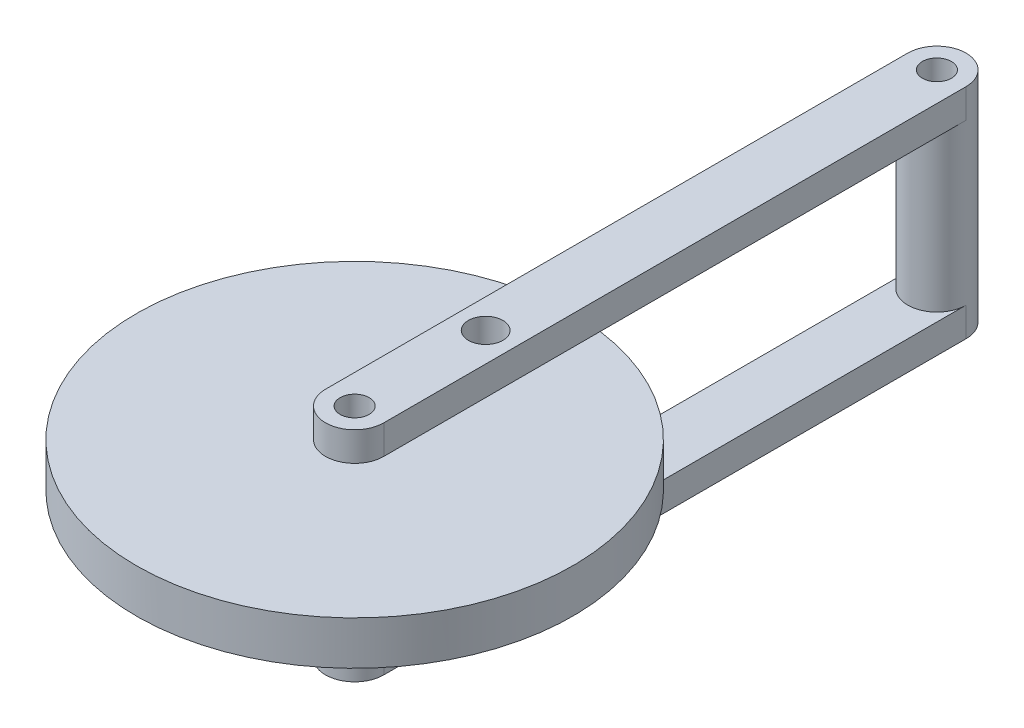
ISO-10303-21;
HEADER;
FILE_DESCRIPTION(('STEP AP214'),'2;1');
FILE_NAME('part.step','',(''),(''),'','','');
FILE_SCHEMA(('AUTOMOTIVE_DESIGN { 1 0 10303 214 1 1 1 1 }'));
ENDSEC;
DATA;
#1=APPLICATION_CONTEXT('core data for automotive mechanical design processes');
#2=APPLICATION_PROTOCOL_DEFINITION('international standard','automotive_design',2000,#1);
#3=PRODUCT_CONTEXT('',#1,'mechanical');
#4=PRODUCT('Part','Part','',(#3));
#5=PRODUCT_RELATED_PRODUCT_CATEGORY('part','',(#4));
#6=PRODUCT_DEFINITION_FORMATION('','',#4);
#7=PRODUCT_DEFINITION_CONTEXT('part definition',#1,'design');
#8=PRODUCT_DEFINITION('design','',#6,#7);
#9=PRODUCT_DEFINITION_SHAPE('','',#8);
#10=(LENGTH_UNIT() NAMED_UNIT(*) SI_UNIT(.MILLI.,.METRE.));
#11=(NAMED_UNIT(*) PLANE_ANGLE_UNIT() SI_UNIT($,.RADIAN.));
#12=(NAMED_UNIT(*) SI_UNIT($,.STERADIAN.) SOLID_ANGLE_UNIT());
#13=UNCERTAINTY_MEASURE_WITH_UNIT(LENGTH_MEASURE(1.E-05),#10,'distance_accuracy_value','');
#14=(GEOMETRIC_REPRESENTATION_CONTEXT(3) GLOBAL_UNCERTAINTY_ASSIGNED_CONTEXT((#13)) GLOBAL_UNIT_ASSIGNED_CONTEXT((#10,
#11,#12)) REPRESENTATION_CONTEXT('',''));
#15=CARTESIAN_POINT('',(0.,0.,0.));
#16=DIRECTION('',(0.,0.,1.));
#17=DIRECTION('',(1.,0.,0.));
#18=AXIS2_PLACEMENT_3D('',#15,#16,#17);
#19=CARTESIAN_POINT('',(0.,2.,0.));
#20=DIRECTION('',(0.,-1.,0.));
#21=DIRECTION('',(0.,0.,-1.));
#22=AXIS2_PLACEMENT_3D('',#19,#20,#21);
#23=CYLINDRICAL_SURFACE('',#22,2.);
#24=CARTESIAN_POINT('',(0.,0.,0.));
#25=DIRECTION('',(0.,1.,0.));
#26=DIRECTION('',(0.,0.,1.));
#27=AXIS2_PLACEMENT_3D('',#24,#25,#26);
#28=CIRCLE('',#27,2.);
#29=CARTESIAN_POINT('',(2.,0.,0.));
#30=VERTEX_POINT('',#29);
#31=CARTESIAN_POINT('',(-2.,0.,0.));
#32=VERTEX_POINT('',#31);
#33=EDGE_CURVE('E154',#30,#32,#28,.T.);
#34=ORIENTED_EDGE('',*,*,#33,.T.);
#35=DIRECTION('',(0.,-1.,0.));
#36=VECTOR('',#35,1.);
#37=CARTESIAN_POINT('',(-2.,2.,0.));
#38=LINE('',#37,#36);
#39=CARTESIAN_POINT('',(-2.,2.,0.));
#40=VERTEX_POINT('',#39);
#41=EDGE_CURVE('E158',#40,#32,#38,.T.);
#42=ORIENTED_EDGE('',*,*,#41,.F.);
#43=CARTESIAN_POINT('',(0.,2.,0.));
#44=DIRECTION('',(0.,1.,0.));
#45=DIRECTION('',(0.,0.,1.));
#46=AXIS2_PLACEMENT_3D('',#43,#44,#45);
#47=CIRCLE('',#46,2.);
#48=CARTESIAN_POINT('',(2.,2.,0.));
#49=VERTEX_POINT('',#48);
#50=EDGE_CURVE('E155',#40,#49,#47,.T.);
#51=ORIENTED_EDGE('',*,*,#50,.T.);
#52=DIRECTION('',(0.,-1.,0.));
#53=VECTOR('',#52,1.);
#54=CARTESIAN_POINT('',(2.,2.,0.));
#55=LINE('',#54,#53);
#56=EDGE_CURVE('E167',#49,#30,#55,.T.);
#57=ORIENTED_EDGE('',*,*,#56,.T.);
#58=EDGE_LOOP('',(#34,#42,#51,#57));
#59=FACE_BOUND('',#58,.T.);
#60=CARTESIAN_POINT('',(0.,13.,0.));
#61=DIRECTION('',(0.,1.,0.));
#62=DIRECTION('',(0.,0.,1.));
#63=AXIS2_PLACEMENT_3D('',#60,#61,#62);
#64=CIRCLE('',#63,2.);
#65=CARTESIAN_POINT('',(-2.,13.,0.));
#66=VERTEX_POINT('',#65);
#67=CARTESIAN_POINT('',(2.,13.,0.));
#68=VERTEX_POINT('',#67);
#69=EDGE_CURVE('E43',#66,#68,#64,.T.);
#70=ORIENTED_EDGE('',*,*,#69,.F.);
#71=DIRECTION('',(0.,-1.,0.));
#72=VECTOR('',#71,1.);
#73=CARTESIAN_POINT('',(-2.,15.,0.));
#74=LINE('',#73,#72);
#75=CARTESIAN_POINT('',(-2.,15.,0.));
#76=VERTEX_POINT('',#75);
#77=EDGE_CURVE('E152',#76,#66,#74,.T.);
#78=ORIENTED_EDGE('',*,*,#77,.F.);
#79=CARTESIAN_POINT('',(0.,15.,0.));
#80=DIRECTION('',(0.,1.,0.));
#81=DIRECTION('',(0.,0.,1.));
#82=AXIS2_PLACEMENT_3D('',#79,#80,#81);
#83=CIRCLE('',#82,2.);
#84=CARTESIAN_POINT('',(2.,15.,0.));
#85=VERTEX_POINT('',#84);
#86=EDGE_CURVE('E112',#85,#76,#83,.T.);
#87=ORIENTED_EDGE('',*,*,#86,.F.);
#88=DIRECTION('',(0.,-1.,0.));
#89=VECTOR('',#88,1.);
#90=CARTESIAN_POINT('',(2.,15.,0.));
#91=LINE('',#90,#89);
#92=EDGE_CURVE('E143',#85,#68,#91,.T.);
#93=ORIENTED_EDGE('',*,*,#92,.T.);
#94=EDGE_LOOP('',(#70,#78,#87,#93));
#95=FACE_BOUND('',#94,.T.);
#96=ADVANCED_FACE('F36',(#59,#95),#23,.T.);
#97=CARTESIAN_POINT('',(-2.,2.,0.));
#98=DIRECTION('',(1.,0.,0.));
#99=DIRECTION('',(0.,0.,-1.));
#100=AXIS2_PLACEMENT_3D('',#97,#98,#99);
#101=PLANE('',#100);
#102=DIRECTION('',(0.,0.,1.));
#103=VECTOR('',#102,1.);
#104=CARTESIAN_POINT('',(-2.,0.,0.));
#105=LINE('',#104,#103);
#106=CARTESIAN_POINT('',(-2.,0.,40.));
#107=VERTEX_POINT('',#106);
#108=EDGE_CURVE('E170',#32,#107,#105,.T.);
#109=ORIENTED_EDGE('',*,*,#108,.T.);
#110=DIRECTION('',(0.,-1.,0.));
#111=VECTOR('',#110,1.);
#112=CARTESIAN_POINT('',(-2.,2.,40.));
#113=LINE('',#112,#111);
#114=CARTESIAN_POINT('',(-2.,2.,40.));
#115=VERTEX_POINT('',#114);
#116=EDGE_CURVE('E180',#115,#107,#113,.T.);
#117=ORIENTED_EDGE('',*,*,#116,.F.);
#118=DIRECTION('',(0.,0.,1.));
#119=VECTOR('',#118,1.);
#120=CARTESIAN_POINT('',(-2.,2.,0.));
#121=LINE('',#120,#119);
#122=EDGE_CURVE('E159',#40,#115,#121,.T.);
#123=ORIENTED_EDGE('',*,*,#122,.F.);
#124=ORIENTED_EDGE('',*,*,#41,.T.);
#125=EDGE_LOOP('',(#109,#117,#123,#124));
#126=FACE_BOUND('',#125,.T.);
#127=ADVANCED_FACE('F187',(#126),#101,.F.);
#128=CARTESIAN_POINT('',(0.,2.,40.));
#129=DIRECTION('',(0.,-1.,0.));
#130=DIRECTION('',(0.,0.,-1.));
#131=AXIS2_PLACEMENT_3D('',#128,#129,#130);
#132=CYLINDRICAL_SURFACE('',#131,2.);
#133=CARTESIAN_POINT('',(0.,0.,40.));
#134=DIRECTION('',(0.,1.,0.));
#135=DIRECTION('',(0.,0.,1.));
#136=AXIS2_PLACEMENT_3D('',#133,#134,#135);
#137=CIRCLE('',#136,2.);
#138=CARTESIAN_POINT('',(2.,0.,40.));
#139=VERTEX_POINT('',#138);
#140=EDGE_CURVE('E172',#107,#139,#137,.T.);
#141=ORIENTED_EDGE('',*,*,#140,.T.);
#142=DIRECTION('',(0.,-1.,0.));
#143=VECTOR('',#142,1.);
#144=CARTESIAN_POINT('',(2.,2.,40.));
#145=LINE('',#144,#143);
#146=CARTESIAN_POINT('',(2.,2.,40.));
#147=VERTEX_POINT('',#146);
#148=EDGE_CURVE('E178',#147,#139,#145,.T.);
#149=ORIENTED_EDGE('',*,*,#148,.F.);
#150=CARTESIAN_POINT('',(0.,2.,40.));
#151=DIRECTION('',(0.,1.,0.));
#152=DIRECTION('',(0.,0.,1.));
#153=AXIS2_PLACEMENT_3D('',#150,#151,#152);
#154=CIRCLE('',#153,2.);
#155=EDGE_CURVE('E161',#115,#147,#154,.T.);
#156=ORIENTED_EDGE('',*,*,#155,.F.);
#157=ORIENTED_EDGE('',*,*,#116,.T.);
#158=EDGE_LOOP('',(#141,#149,#156,#157));
#159=FACE_BOUND('',#158,.T.);
#160=ADVANCED_FACE('F202',(#159),#132,.T.);
#161=CARTESIAN_POINT('',(2.,2.,0.));
#162=DIRECTION('',(1.,0.,0.));
#163=DIRECTION('',(0.,0.,-1.));
#164=AXIS2_PLACEMENT_3D('',#161,#162,#163);
#165=PLANE('',#164);
#166=DIRECTION('',(0.,0.,1.));
#167=VECTOR('',#166,1.);
#168=CARTESIAN_POINT('',(2.,0.,0.));
#169=LINE('',#168,#167);
#170=EDGE_CURVE('E162',#30,#139,#169,.T.);
#171=ORIENTED_EDGE('',*,*,#170,.F.);
#172=ORIENTED_EDGE('',*,*,#56,.F.);
#173=DIRECTION('',(0.,0.,1.));
#174=VECTOR('',#173,1.);
#175=CARTESIAN_POINT('',(2.,2.,0.));
#176=LINE('',#175,#174);
#177=EDGE_CURVE('E164',#49,#147,#176,.T.);
#178=ORIENTED_EDGE('',*,*,#177,.T.);
#179=ORIENTED_EDGE('',*,*,#148,.T.);
#180=EDGE_LOOP('',(#171,#172,#178,#179));
#181=FACE_BOUND('',#180,.T.);
#182=ADVANCED_FACE('F198',(#181),#165,.T.);
#183=CARTESIAN_POINT('',(0.,2.,0.));
#184=DIRECTION('',(0.,1.,0.));
#185=DIRECTION('',(0.,0.,1.));
#186=AXIS2_PLACEMENT_3D('',#183,#184,#185);
#187=PLANE('',#186);
#188=CARTESIAN_POINT('',(0.,2.,40.));
#189=DIRECTION('',(0.,1.,0.));
#190=DIRECTION('',(0.,0.,1.));
#191=AXIS2_PLACEMENT_3D('',#188,#189,#190);
#192=CIRCLE('',#191,0.999999999999986);
#193=CARTESIAN_POINT('',(0.,2.,41.));
#194=VERTEX_POINT('',#193);
#195=EDGE_CURVE('E131',#194,#194,#192,.T.);
#196=ORIENTED_EDGE('',*,*,#195,.F.);
#197=EDGE_LOOP('',(#196));
#198=FACE_BOUND('',#197,.T.);
#199=ORIENTED_EDGE('',*,*,#50,.F.);
#200=ORIENTED_EDGE('',*,*,#122,.T.);
#201=ORIENTED_EDGE('',*,*,#155,.T.);
#202=ORIENTED_EDGE('',*,*,#177,.F.);
#203=EDGE_LOOP('',(#199,#200,#201,#202));
#204=FACE_BOUND('',#203,.T.);
#205=ADVANCED_FACE('F204',(#198,#204),#187,.T.);
#206=CARTESIAN_POINT('',(0.,0.,0.));
#207=DIRECTION('',(0.,1.,0.));
#208=DIRECTION('',(0.,0.,1.));
#209=AXIS2_PLACEMENT_3D('',#206,#207,#208);
#210=PLANE('',#209);
#211=CARTESIAN_POINT('',(0.,0.,0.));
#212=DIRECTION('',(0.,1.,0.));
#213=DIRECTION('',(0.,0.,1.));
#214=AXIS2_PLACEMENT_3D('',#211,#212,#213);
#215=CIRCLE('',#214,0.999999999999985);
#216=CARTESIAN_POINT('',(0.,0.,0.999999999999985));
#217=VERTEX_POINT('',#216);
#218=EDGE_CURVE('E381',#217,#217,#215,.T.);
#219=ORIENTED_EDGE('',*,*,#218,.T.);
#220=EDGE_LOOP('',(#219));
#221=FACE_BOUND('',#220,.T.);
#222=CARTESIAN_POINT('',(0.,0.,40.));
#223=DIRECTION('',(0.,1.,0.));
#224=DIRECTION('',(0.,0.,1.));
#225=AXIS2_PLACEMENT_3D('',#222,#223,#224);
#226=CIRCLE('',#225,0.999999999999985);
#227=CARTESIAN_POINT('',(0.,0.,41.));
#228=VERTEX_POINT('',#227);
#229=EDGE_CURVE('E387',#228,#228,#226,.T.);
#230=ORIENTED_EDGE('',*,*,#229,.T.);
#231=EDGE_LOOP('',(#230));
#232=FACE_BOUND('',#231,.T.);
#233=ORIENTED_EDGE('',*,*,#33,.F.);
#234=ORIENTED_EDGE('',*,*,#170,.T.);
#235=ORIENTED_EDGE('',*,*,#140,.F.);
#236=ORIENTED_EDGE('',*,*,#108,.F.);
#237=EDGE_LOOP('',(#233,#234,#235,#236));
#238=FACE_BOUND('',#237,.T.);
#239=ADVANCED_FACE('F195',(#221,#232,#238),#210,.F.);
#240=CARTESIAN_POINT('',(-2.,15.,0.));
#241=DIRECTION('',(1.,0.,0.));
#242=DIRECTION('',(0.,0.,-1.));
#243=AXIS2_PLACEMENT_3D('',#240,#241,#242);
#244=PLANE('',#243);
#245=DIRECTION('',(0.,0.,1.));
#246=VECTOR('',#245,1.);
#247=CARTESIAN_POINT('',(-2.,13.,0.));
#248=LINE('',#247,#246);
#249=CARTESIAN_POINT('',(-2.,13.,25.1339312526815));
#250=VERTEX_POINT('',#249);
#251=EDGE_CURVE('E144',#66,#250,#248,.T.);
#252=ORIENTED_EDGE('',*,*,#251,.T.);
#253=CARTESIAN_POINT('',(-2.,13.,40.));
#254=VERTEX_POINT('',#253);
#255=EDGE_CURVE('E124',#250,#254,#248,.T.);
#256=ORIENTED_EDGE('',*,*,#255,.T.);
#257=DIRECTION('',(0.,-1.,0.));
#258=VECTOR('',#257,1.);
#259=CARTESIAN_POINT('',(-2.,15.,40.));
#260=LINE('',#259,#258);
#261=CARTESIAN_POINT('',(-2.,15.,40.));
#262=VERTEX_POINT('',#261);
#263=EDGE_CURVE('E149',#262,#254,#260,.T.);
#264=ORIENTED_EDGE('',*,*,#263,.F.);
#265=DIRECTION('',(0.,0.,1.));
#266=VECTOR('',#265,1.);
#267=CARTESIAN_POINT('',(-2.,15.,0.));
#268=LINE('',#267,#266);
#269=EDGE_CURVE('E136',#76,#262,#268,.T.);
#270=ORIENTED_EDGE('',*,*,#269,.F.);
#271=ORIENTED_EDGE('',*,*,#77,.T.);
#272=EDGE_LOOP('',(#252,#256,#264,#270,#271));
#273=FACE_BOUND('',#272,.T.);
#274=ADVANCED_FACE('F212',(#273),#244,.F.);
#275=CARTESIAN_POINT('',(0.,15.,40.));
#276=DIRECTION('',(0.,-1.,0.));
#277=DIRECTION('',(0.,0.,-1.));
#278=AXIS2_PLACEMENT_3D('',#275,#276,#277);
#279=CYLINDRICAL_SURFACE('',#278,2.);
#280=CARTESIAN_POINT('',(0.,13.,40.));
#281=DIRECTION('',(0.,1.,0.));
#282=DIRECTION('',(0.,0.,1.));
#283=AXIS2_PLACEMENT_3D('',#280,#281,#282);
#284=CIRCLE('',#283,2.);
#285=CARTESIAN_POINT('',(2.,13.,40.));
#286=VERTEX_POINT('',#285);
#287=EDGE_CURVE('E117',#254,#286,#284,.T.);
#288=ORIENTED_EDGE('',*,*,#287,.T.);
#289=DIRECTION('',(0.,-1.,0.));
#290=VECTOR('',#289,1.);
#291=CARTESIAN_POINT('',(2.,15.,40.));
#292=LINE('',#291,#290);
#293=CARTESIAN_POINT('',(2.,15.,40.));
#294=VERTEX_POINT('',#293);
#295=EDGE_CURVE('E108',#294,#286,#292,.T.);
#296=ORIENTED_EDGE('',*,*,#295,.F.);
#297=CARTESIAN_POINT('',(0.,15.,40.));
#298=DIRECTION('',(0.,1.,0.));
#299=DIRECTION('',(0.,0.,1.));
#300=AXIS2_PLACEMENT_3D('',#297,#298,#299);
#301=CIRCLE('',#300,2.);
#302=EDGE_CURVE('E138',#262,#294,#301,.T.);
#303=ORIENTED_EDGE('',*,*,#302,.F.);
#304=ORIENTED_EDGE('',*,*,#263,.T.);
#305=EDGE_LOOP('',(#288,#296,#303,#304));
#306=FACE_BOUND('',#305,.T.);
#307=ADVANCED_FACE('F251',(#306),#279,.T.);
#308=CARTESIAN_POINT('',(2.,15.,0.));
#309=DIRECTION('',(-1.,0.,0.));
#310=DIRECTION('',(0.,0.,1.));
#311=AXIS2_PLACEMENT_3D('',#308,#309,#310);
#312=PLANE('',#311);
#313=DIRECTION('',(0.,0.,-1.));
#314=VECTOR('',#313,1.);
#315=CARTESIAN_POINT('',(2.,13.,0.));
#316=LINE('',#315,#314);
#317=CARTESIAN_POINT('',(2.,13.,25.1339312526815));
#318=VERTEX_POINT('',#317);
#319=EDGE_CURVE('E104',#286,#318,#316,.T.);
#320=ORIENTED_EDGE('',*,*,#319,.T.);
#321=EDGE_CURVE('E55',#318,#68,#316,.T.);
#322=ORIENTED_EDGE('',*,*,#321,.T.);
#323=ORIENTED_EDGE('',*,*,#92,.F.);
#324=DIRECTION('',(0.,0.,-1.));
#325=VECTOR('',#324,1.);
#326=CARTESIAN_POINT('',(2.,15.,0.));
#327=LINE('',#326,#325);
#328=EDGE_CURVE('E140',#294,#85,#327,.T.);
#329=ORIENTED_EDGE('',*,*,#328,.F.);
#330=ORIENTED_EDGE('',*,*,#295,.T.);
#331=EDGE_LOOP('',(#320,#322,#323,#329,#330));
#332=FACE_BOUND('',#331,.T.);
#333=ADVANCED_FACE('F105',(#332),#312,.F.);
#334=CARTESIAN_POINT('',(0.,15.,0.));
#335=DIRECTION('',(0.,1.,0.));
#336=DIRECTION('',(0.,0.,1.));
#337=AXIS2_PLACEMENT_3D('',#334,#335,#336);
#338=PLANE('',#337);
#339=CARTESIAN_POINT('',(0.,15.,31.));
#340=DIRECTION('',(0.,1.,0.));
#341=DIRECTION('',(0.,0.,1.));
#342=AXIS2_PLACEMENT_3D('',#339,#340,#341);
#343=CIRCLE('',#342,1.18745);
#344=CARTESIAN_POINT('',(0.,15.,32.18745));
#345=VERTEX_POINT('',#344);
#346=EDGE_CURVE('E374',#345,#345,#343,.T.);
#347=ORIENTED_EDGE('',*,*,#346,.F.);
#348=EDGE_LOOP('',(#347));
#349=FACE_BOUND('',#348,.T.);
#350=CARTESIAN_POINT('',(0.,15.,0.));
#351=DIRECTION('',(0.,1.,0.));
#352=DIRECTION('',(0.,0.,1.));
#353=AXIS2_PLACEMENT_3D('',#350,#351,#352);
#354=CIRCLE('',#353,0.999999999999987);
#355=CARTESIAN_POINT('',(0.,15.,0.999999999999987));
#356=VERTEX_POINT('',#355);
#357=EDGE_CURVE('E376',#356,#356,#354,.T.);
#358=ORIENTED_EDGE('',*,*,#357,.F.);
#359=EDGE_LOOP('',(#358));
#360=FACE_BOUND('',#359,.T.);
#361=CARTESIAN_POINT('',(0.,15.,40.));
#362=DIRECTION('',(0.,1.,0.));
#363=DIRECTION('',(0.,0.,1.));
#364=AXIS2_PLACEMENT_3D('',#361,#362,#363);
#365=CIRCLE('',#364,0.999999999999987);
#366=CARTESIAN_POINT('',(0.,15.,41.));
#367=VERTEX_POINT('',#366);
#368=EDGE_CURVE('E384',#367,#367,#365,.T.);
#369=ORIENTED_EDGE('',*,*,#368,.F.);
#370=EDGE_LOOP('',(#369));
#371=FACE_BOUND('',#370,.T.);
#372=ORIENTED_EDGE('',*,*,#86,.T.);
#373=ORIENTED_EDGE('',*,*,#269,.T.);
#374=ORIENTED_EDGE('',*,*,#302,.T.);
#375=ORIENTED_EDGE('',*,*,#328,.T.);
#376=EDGE_LOOP('',(#372,#373,#374,#375));
#377=FACE_BOUND('',#376,.T.);
#378=ADVANCED_FACE('F269',(#349,#360,#371,#377),#338,.T.);
#379=CARTESIAN_POINT('',(0.,13.,0.));
#380=DIRECTION('',(0.,1.,0.));
#381=DIRECTION('',(0.,0.,1.));
#382=AXIS2_PLACEMENT_3D('',#379,#380,#381);
#383=PLANE('',#382);
#384=CARTESIAN_POINT('',(0.,13.,40.));
#385=DIRECTION('',(0.,1.,0.));
#386=DIRECTION('',(0.,0.,1.));
#387=AXIS2_PLACEMENT_3D('',#384,#385,#386);
#388=CIRCLE('',#387,15.);
#389=EDGE_CURVE('E11',#250,#318,#388,.F.);
#390=ORIENTED_EDGE('',*,*,#389,.F.);
#391=ORIENTED_EDGE('',*,*,#251,.F.);
#392=ORIENTED_EDGE('',*,*,#69,.T.);
#393=ORIENTED_EDGE('',*,*,#321,.F.);
#394=EDGE_LOOP('',(#390,#391,#392,#393));
#395=FACE_BOUND('',#394,.T.);
#396=ADVANCED_FACE('F115',(#395),#383,.F.);
#397=CARTESIAN_POINT('',(0.,13.,40.));
#398=DIRECTION('',(0.,-1.,0.));
#399=DIRECTION('',(0.,0.,-1.));
#400=AXIS2_PLACEMENT_3D('',#397,#398,#399);
#401=PLANE('',#400);
#402=ORIENTED_EDGE('',*,*,#287,.F.);
#403=ORIENTED_EDGE('',*,*,#255,.F.);
#404=CARTESIAN_POINT('',(0.,13.,40.));
#405=DIRECTION('',(0.,-1.,0.));
#406=DIRECTION('',(0.,0.,-1.));
#407=AXIS2_PLACEMENT_3D('',#404,#405,#406);
#408=CIRCLE('',#407,15.);
#409=EDGE_CURVE('E121',#318,#250,#408,.T.);
#410=ORIENTED_EDGE('',*,*,#409,.F.);
#411=ORIENTED_EDGE('',*,*,#319,.F.);
#412=EDGE_LOOP('',(#402,#403,#410,#411));
#413=FACE_BOUND('',#412,.T.);
#414=ADVANCED_FACE('F123',(#413),#401,.F.);
#415=CARTESIAN_POINT('',(0.,10.,40.));
#416=DIRECTION('',(0.,1.,0.));
#417=DIRECTION('',(0.,0.,1.));
#418=AXIS2_PLACEMENT_3D('',#415,#416,#417);
#419=CYLINDRICAL_SURFACE('',#418,15.);
#420=CARTESIAN_POINT('',(0.,10.,40.));
#421=DIRECTION('',(0.,-1.,0.));
#422=DIRECTION('',(0.,0.,-1.));
#423=AXIS2_PLACEMENT_3D('',#420,#421,#422);
#424=CIRCLE('',#423,15.);
#425=CARTESIAN_POINT('',(0.,10.,25.));
#426=VERTEX_POINT('',#425);
#427=EDGE_CURVE('E125',#426,#426,#424,.T.);
#428=ORIENTED_EDGE('',*,*,#427,.F.);
#429=EDGE_LOOP('',(#428));
#430=FACE_BOUND('',#429,.T.);
#431=ORIENTED_EDGE('',*,*,#409,.T.);
#432=ORIENTED_EDGE('',*,*,#389,.T.);
#433=EDGE_LOOP('',(#431,#432));
#434=FACE_BOUND('',#433,.T.);
#435=ADVANCED_FACE('F120',(#430,#434),#419,.T.);
#436=CARTESIAN_POINT('',(0.,10.,40.));
#437=DIRECTION('',(0.,-1.,0.));
#438=DIRECTION('',(0.,0.,-1.));
#439=AXIS2_PLACEMENT_3D('',#436,#437,#438);
#440=PLANE('',#439);
#441=CARTESIAN_POINT('',(0.,10.,31.));
#442=DIRECTION('',(0.,-1.,0.));
#443=DIRECTION('',(0.,0.,-1.));
#444=AXIS2_PLACEMENT_3D('',#441,#442,#443);
#445=CIRCLE('',#444,1.18745);
#446=CARTESIAN_POINT('',(0.,10.,29.81255));
#447=VERTEX_POINT('',#446);
#448=EDGE_CURVE('E371',#447,#447,#445,.T.);
#449=ORIENTED_EDGE('',*,*,#448,.F.);
#450=EDGE_LOOP('',(#449));
#451=FACE_BOUND('',#450,.T.);
#452=CARTESIAN_POINT('',(0.,10.,40.));
#453=DIRECTION('',(0.,-1.,0.));
#454=DIRECTION('',(0.,0.,-1.));
#455=AXIS2_PLACEMENT_3D('',#452,#453,#454);
#456=CIRCLE('',#455,0.999999999999986);
#457=CARTESIAN_POINT('',(0.,10.,39.));
#458=VERTEX_POINT('',#457);
#459=EDGE_CURVE('E126',#458,#458,#456,.T.);
#460=ORIENTED_EDGE('',*,*,#459,.F.);
#461=EDGE_LOOP('',(#460));
#462=FACE_BOUND('',#461,.T.);
#463=ORIENTED_EDGE('',*,*,#427,.T.);
#464=EDGE_LOOP('',(#463));
#465=FACE_BOUND('',#464,.T.);
#466=ADVANCED_FACE('F295',(#451,#462,#465),#440,.T.);
#467=CARTESIAN_POINT('',(0.,15.,40.));
#468=DIRECTION('',(0.,1.,0.));
#469=DIRECTION('',(0.,0.,1.));
#470=AXIS2_PLACEMENT_3D('',#467,#468,#469);
#471=CYLINDRICAL_SURFACE('',#470,0.999999999999986);
#472=ORIENTED_EDGE('',*,*,#195,.T.);
#473=EDGE_LOOP('',(#472));
#474=FACE_BOUND('',#473,.T.);
#475=ORIENTED_EDGE('',*,*,#229,.F.);
#476=EDGE_LOOP('',(#475));
#477=FACE_BOUND('',#476,.T.);
#478=ADVANCED_FACE('F314',(#474,#477),#471,.F.);
#479=ORIENTED_EDGE('',*,*,#459,.T.);
#480=EDGE_LOOP('',(#479));
#481=FACE_BOUND('',#480,.T.);
#482=ORIENTED_EDGE('',*,*,#368,.T.);
#483=EDGE_LOOP('',(#482));
#484=FACE_BOUND('',#483,.T.);
#485=ADVANCED_FACE('F319',(#481,#484),#471,.F.);
#486=CARTESIAN_POINT('',(0.,15.,0.));
#487=DIRECTION('',(0.,1.,0.));
#488=DIRECTION('',(0.,0.,1.));
#489=AXIS2_PLACEMENT_3D('',#486,#487,#488);
#490=CYLINDRICAL_SURFACE('',#489,0.999999999999986);
#491=ORIENTED_EDGE('',*,*,#218,.F.);
#492=EDGE_LOOP('',(#491));
#493=FACE_BOUND('',#492,.T.);
#494=ORIENTED_EDGE('',*,*,#357,.T.);
#495=EDGE_LOOP('',(#494));
#496=FACE_BOUND('',#495,.T.);
#497=ADVANCED_FACE('F329',(#493,#496),#490,.F.);
#498=CARTESIAN_POINT('',(0.,15.,31.));
#499=DIRECTION('',(0.,1.,0.));
#500=DIRECTION('',(0.,0.,1.));
#501=AXIS2_PLACEMENT_3D('',#498,#499,#500);
#502=CYLINDRICAL_SURFACE('',#501,1.18745);
#503=ORIENTED_EDGE('',*,*,#448,.T.);
#504=EDGE_LOOP('',(#503));
#505=FACE_BOUND('',#504,.T.);
#506=ORIENTED_EDGE('',*,*,#346,.T.);
#507=EDGE_LOOP('',(#506));
#508=FACE_BOUND('',#507,.T.);
#509=ADVANCED_FACE('F338',(#505,#508),#502,.F.);
#510=CLOSED_SHELL('',(#96,#127,#160,#182,#205,#239,#274,#307,#333,#378,#396,#414,#435,#466,#478,
#485,#497,#509));
#511=MANIFOLD_SOLID_BREP('B2',#510);
#512=ADVANCED_BREP_SHAPE_REPRESENTATION('',(#18,#511),#14);
#513=SHAPE_DEFINITION_REPRESENTATION(#9,#512);
ENDSEC;
END-ISO-10303-21;
